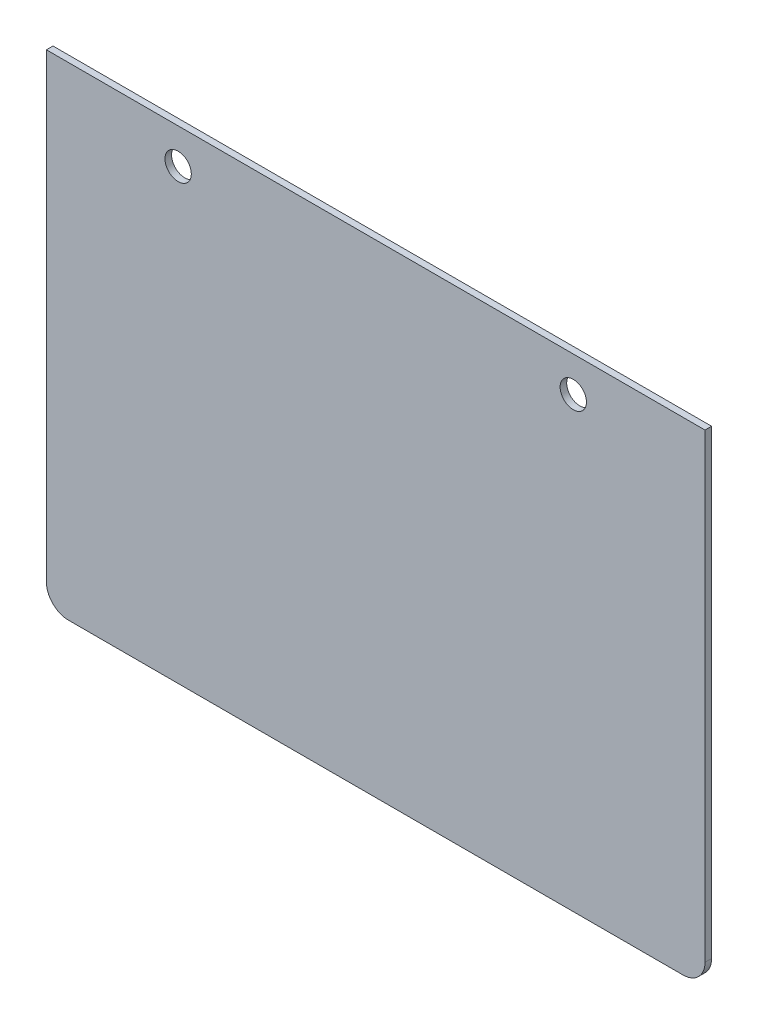
ISO-10303-21;
HEADER;
FILE_DESCRIPTION(('STEP AP214'),'2;1');
FILE_NAME('part.step','',(''),(''),'','','');
FILE_SCHEMA(('AUTOMOTIVE_DESIGN { 1 0 10303 214 1 1 1 1 }'));
ENDSEC;
DATA;
#1=APPLICATION_CONTEXT('core data for automotive mechanical design processes');
#2=APPLICATION_PROTOCOL_DEFINITION('international standard','automotive_design',2000,#1);
#3=PRODUCT_CONTEXT('',#1,'mechanical');
#4=PRODUCT('Part','Part','',(#3));
#5=PRODUCT_RELATED_PRODUCT_CATEGORY('part','',(#4));
#6=PRODUCT_DEFINITION_FORMATION('','',#4);
#7=PRODUCT_DEFINITION_CONTEXT('part definition',#1,'design');
#8=PRODUCT_DEFINITION('design','',#6,#7);
#9=PRODUCT_DEFINITION_SHAPE('','',#8);
#10=(LENGTH_UNIT() NAMED_UNIT(*) SI_UNIT(.MILLI.,.METRE.));
#11=(NAMED_UNIT(*) PLANE_ANGLE_UNIT() SI_UNIT($,.RADIAN.));
#12=(NAMED_UNIT(*) SI_UNIT($,.STERADIAN.) SOLID_ANGLE_UNIT());
#13=UNCERTAINTY_MEASURE_WITH_UNIT(LENGTH_MEASURE(1.E-05),#10,'distance_accuracy_value','');
#14=(GEOMETRIC_REPRESENTATION_CONTEXT(3) GLOBAL_UNCERTAINTY_ASSIGNED_CONTEXT((#13)) GLOBAL_UNIT_ASSIGNED_CONTEXT((#10,
#11,#12)) REPRESENTATION_CONTEXT('',''));
#15=CARTESIAN_POINT('',(0.,0.,0.));
#16=DIRECTION('',(0.,0.,1.));
#17=DIRECTION('',(1.,0.,0.));
#18=AXIS2_PLACEMENT_3D('',#15,#16,#17);
#19=CARTESIAN_POINT('',(0.,0.,-1.5));
#20=DIRECTION('',(-1.,0.,0.));
#21=DIRECTION('',(0.,0.,1.));
#22=AXIS2_PLACEMENT_3D('',#19,#20,#21);
#23=PLANE('',#22);
#24=DIRECTION('',(0.,-1.,0.));
#25=VECTOR('',#24,1.);
#26=CARTESIAN_POINT('',(0.,0.,-1.5));
#27=LINE('',#26,#25);
#28=CARTESIAN_POINT('',(0.,110.,-1.5));
#29=VERTEX_POINT('',#28);
#30=CARTESIAN_POINT('',(0.,5.,-1.5));
#31=VERTEX_POINT('',#30);
#32=EDGE_CURVE('E107',#29,#31,#27,.T.);
#33=ORIENTED_EDGE('',*,*,#32,.T.);
#34=DIRECTION('',(0.,0.,1.));
#35=VECTOR('',#34,1.);
#36=CARTESIAN_POINT('',(0.,5.,-1.5));
#37=LINE('',#36,#35);
#38=CARTESIAN_POINT('',(0.,5.,0.));
#39=VERTEX_POINT('',#38);
#40=EDGE_CURVE('E11',#31,#39,#37,.T.);
#41=ORIENTED_EDGE('',*,*,#40,.T.);
#42=DIRECTION('',(0.,-1.,0.));
#43=VECTOR('',#42,1.);
#44=CARTESIAN_POINT('',(0.,0.,0.));
#45=LINE('',#44,#43);
#46=CARTESIAN_POINT('',(0.,110.,0.));
#47=VERTEX_POINT('',#46);
#48=EDGE_CURVE('E111',#47,#39,#45,.T.);
#49=ORIENTED_EDGE('',*,*,#48,.F.);
#50=DIRECTION('',(0.,0.,1.));
#51=VECTOR('',#50,1.);
#52=CARTESIAN_POINT('',(0.,110.,-1.5));
#53=LINE('',#52,#51);
#54=EDGE_CURVE('E104',#29,#47,#53,.T.);
#55=ORIENTED_EDGE('',*,*,#54,.F.);
#56=EDGE_LOOP('',(#33,#41,#49,#55));
#57=FACE_BOUND('',#56,.T.);
#58=ADVANCED_FACE('F35',(#57),#23,.T.);
#59=CARTESIAN_POINT('',(0.,110.,-1.5));
#60=DIRECTION('',(0.,1.,0.));
#61=DIRECTION('',(0.,0.,1.));
#62=AXIS2_PLACEMENT_3D('',#59,#60,#61);
#63=PLANE('',#62);
#64=DIRECTION('',(-1.,0.,0.));
#65=VECTOR('',#64,1.);
#66=CARTESIAN_POINT('',(0.,110.,0.));
#67=LINE('',#66,#65);
#68=CARTESIAN_POINT('',(150.,110.,0.));
#69=VERTEX_POINT('',#68);
#70=EDGE_CURVE('E103',#69,#47,#67,.T.);
#71=ORIENTED_EDGE('',*,*,#70,.F.);
#72=DIRECTION('',(0.,0.,1.));
#73=VECTOR('',#72,1.);
#74=CARTESIAN_POINT('',(150.,110.,-1.5));
#75=LINE('',#74,#73);
#76=CARTESIAN_POINT('',(150.,110.,-1.5));
#77=VERTEX_POINT('',#76);
#78=EDGE_CURVE('E92',#77,#69,#75,.T.);
#79=ORIENTED_EDGE('',*,*,#78,.F.);
#80=DIRECTION('',(-1.,0.,0.));
#81=VECTOR('',#80,1.);
#82=CARTESIAN_POINT('',(0.,110.,-1.5));
#83=LINE('',#82,#81);
#84=EDGE_CURVE('E96',#77,#29,#83,.T.);
#85=ORIENTED_EDGE('',*,*,#84,.T.);
#86=ORIENTED_EDGE('',*,*,#54,.T.);
#87=EDGE_LOOP('',(#71,#79,#85,#86));
#88=FACE_BOUND('',#87,.T.);
#89=ADVANCED_FACE('F101',(#88),#63,.T.);
#90=CARTESIAN_POINT('',(150.,0.,-1.5));
#91=DIRECTION('',(1.,0.,0.));
#92=DIRECTION('',(0.,0.,-1.));
#93=AXIS2_PLACEMENT_3D('',#90,#91,#92);
#94=PLANE('',#93);
#95=DIRECTION('',(0.,1.,0.));
#96=VECTOR('',#95,1.);
#97=CARTESIAN_POINT('',(150.,0.,0.));
#98=LINE('',#97,#96);
#99=CARTESIAN_POINT('',(150.,5.,0.));
#100=VERTEX_POINT('',#99);
#101=EDGE_CURVE('E118',#100,#69,#98,.T.);
#102=ORIENTED_EDGE('',*,*,#101,.F.);
#103=DIRECTION('',(0.,0.,1.));
#104=VECTOR('',#103,1.);
#105=CARTESIAN_POINT('',(150.,5.,-1.5));
#106=LINE('',#105,#104);
#107=CARTESIAN_POINT('',(150.,5.,-1.5));
#108=VERTEX_POINT('',#107);
#109=EDGE_CURVE('E58',#100,#108,#106,.F.);
#110=ORIENTED_EDGE('',*,*,#109,.T.);
#111=DIRECTION('',(0.,1.,0.));
#112=VECTOR('',#111,1.);
#113=CARTESIAN_POINT('',(150.,0.,-1.5));
#114=LINE('',#113,#112);
#115=EDGE_CURVE('E89',#108,#77,#114,.T.);
#116=ORIENTED_EDGE('',*,*,#115,.T.);
#117=ORIENTED_EDGE('',*,*,#78,.T.);
#118=EDGE_LOOP('',(#102,#110,#116,#117));
#119=FACE_BOUND('',#118,.T.);
#120=ADVANCED_FACE('F91',(#119),#94,.T.);
#121=CARTESIAN_POINT('',(0.,0.,-1.5));
#122=DIRECTION('',(0.,-1.,0.));
#123=DIRECTION('',(0.,0.,-1.));
#124=AXIS2_PLACEMENT_3D('',#121,#122,#123);
#125=PLANE('',#124);
#126=DIRECTION('',(1.,0.,0.));
#127=VECTOR('',#126,1.);
#128=CARTESIAN_POINT('',(0.,0.,-1.5));
#129=LINE('',#128,#127);
#130=CARTESIAN_POINT('',(5.,0.,-1.5));
#131=VERTEX_POINT('',#130);
#132=CARTESIAN_POINT('',(145.,0.,-1.5));
#133=VERTEX_POINT('',#132);
#134=EDGE_CURVE('E97',#131,#133,#129,.T.);
#135=ORIENTED_EDGE('',*,*,#134,.T.);
#136=DIRECTION('',(0.,0.,1.));
#137=VECTOR('',#136,1.);
#138=CARTESIAN_POINT('',(145.,0.,-1.5));
#139=LINE('',#138,#137);
#140=CARTESIAN_POINT('',(145.,0.,0.));
#141=VERTEX_POINT('',#140);
#142=EDGE_CURVE('E124',#133,#141,#139,.T.);
#143=ORIENTED_EDGE('',*,*,#142,.T.);
#144=DIRECTION('',(1.,0.,0.));
#145=VECTOR('',#144,1.);
#146=CARTESIAN_POINT('',(0.,0.,0.));
#147=LINE('',#146,#145);
#148=CARTESIAN_POINT('',(5.,0.,0.));
#149=VERTEX_POINT('',#148);
#150=EDGE_CURVE('E114',#149,#141,#147,.T.);
#151=ORIENTED_EDGE('',*,*,#150,.F.);
#152=DIRECTION('',(0.,0.,1.));
#153=VECTOR('',#152,1.);
#154=CARTESIAN_POINT('',(5.,0.,-1.5));
#155=LINE('',#154,#153);
#156=EDGE_CURVE('E121',#149,#131,#155,.F.);
#157=ORIENTED_EDGE('',*,*,#156,.T.);
#158=EDGE_LOOP('',(#135,#143,#151,#157));
#159=FACE_BOUND('',#158,.T.);
#160=ADVANCED_FACE('F136',(#159),#125,.T.);
#161=CARTESIAN_POINT('',(0.,110.,-1.5));
#162=DIRECTION('',(0.,0.,-1.));
#163=DIRECTION('',(-1.,0.,0.));
#164=AXIS2_PLACEMENT_3D('',#161,#162,#163);
#165=PLANE('',#164);
#166=CARTESIAN_POINT('',(120.,102.,-1.5));
#167=DIRECTION('',(0.,0.,-1.));
#168=DIRECTION('',(-1.,0.,0.));
#169=AXIS2_PLACEMENT_3D('',#166,#167,#168);
#170=CIRCLE('',#169,2.99999999999999);
#171=CARTESIAN_POINT('',(117.,102.,-1.5));
#172=VERTEX_POINT('',#171);
#173=EDGE_CURVE('E153',#172,#172,#170,.T.);
#174=ORIENTED_EDGE('',*,*,#173,.F.);
#175=EDGE_LOOP('',(#174));
#176=FACE_BOUND('',#175,.T.);
#177=CARTESIAN_POINT('',(30.,102.,-1.5));
#178=DIRECTION('',(0.,0.,-1.));
#179=DIRECTION('',(-1.,0.,0.));
#180=AXIS2_PLACEMENT_3D('',#177,#178,#179);
#181=CIRCLE('',#180,2.99999999999999);
#182=CARTESIAN_POINT('',(27.,102.,-1.5));
#183=VERTEX_POINT('',#182);
#184=EDGE_CURVE('E115',#183,#183,#181,.T.);
#185=ORIENTED_EDGE('',*,*,#184,.F.);
#186=EDGE_LOOP('',(#185));
#187=FACE_BOUND('',#186,.T.);
#188=ORIENTED_EDGE('',*,*,#115,.F.);
#189=CARTESIAN_POINT('',(145.,5.,-1.5));
#190=DIRECTION('',(0.,0.,-1.));
#191=DIRECTION('',(-1.,0.,0.));
#192=AXIS2_PLACEMENT_3D('',#189,#190,#191);
#193=CIRCLE('',#192,5.);
#194=EDGE_CURVE('E43',#108,#133,#193,.T.);
#195=ORIENTED_EDGE('',*,*,#194,.T.);
#196=ORIENTED_EDGE('',*,*,#134,.F.);
#197=CARTESIAN_POINT('',(5.,5.,-1.5));
#198=DIRECTION('',(0.,0.,-1.));
#199=DIRECTION('',(-1.,0.,0.));
#200=AXIS2_PLACEMENT_3D('',#197,#198,#199);
#201=CIRCLE('',#200,5.);
#202=EDGE_CURVE('E50',#131,#31,#201,.T.);
#203=ORIENTED_EDGE('',*,*,#202,.T.);
#204=ORIENTED_EDGE('',*,*,#32,.F.);
#205=ORIENTED_EDGE('',*,*,#84,.F.);
#206=EDGE_LOOP('',(#188,#195,#196,#203,#204,#205));
#207=FACE_BOUND('',#206,.T.);
#208=ADVANCED_FACE('F106',(#176,#187,#207),#165,.T.);
#209=CARTESIAN_POINT('',(0.,110.,0.));
#210=DIRECTION('',(0.,0.,-1.));
#211=DIRECTION('',(-1.,0.,0.));
#212=AXIS2_PLACEMENT_3D('',#209,#210,#211);
#213=PLANE('',#212);
#214=CARTESIAN_POINT('',(120.,102.,0.));
#215=DIRECTION('',(0.,0.,1.));
#216=DIRECTION('',(-1.,0.,0.));
#217=AXIS2_PLACEMENT_3D('',#214,#215,#216);
#218=CIRCLE('',#217,2.99999999999999);
#219=CARTESIAN_POINT('',(117.,102.,0.));
#220=VERTEX_POINT('',#219);
#221=EDGE_CURVE('E156',#220,#220,#218,.T.);
#222=ORIENTED_EDGE('',*,*,#221,.F.);
#223=EDGE_LOOP('',(#222));
#224=FACE_BOUND('',#223,.T.);
#225=CARTESIAN_POINT('',(30.,102.,0.));
#226=DIRECTION('',(0.,0.,1.));
#227=DIRECTION('',(1.,0.,0.));
#228=AXIS2_PLACEMENT_3D('',#225,#226,#227);
#229=CIRCLE('',#228,2.99999999999999);
#230=CARTESIAN_POINT('',(33.,102.,0.));
#231=VERTEX_POINT('',#230);
#232=EDGE_CURVE('E150',#231,#231,#229,.T.);
#233=ORIENTED_EDGE('',*,*,#232,.F.);
#234=EDGE_LOOP('',(#233));
#235=FACE_BOUND('',#234,.T.);
#236=ORIENTED_EDGE('',*,*,#150,.T.);
#237=CARTESIAN_POINT('',(145.,5.,0.));
#238=DIRECTION('',(0.,0.,-1.));
#239=DIRECTION('',(-1.,0.,0.));
#240=AXIS2_PLACEMENT_3D('',#237,#238,#239);
#241=CIRCLE('',#240,5.);
#242=EDGE_CURVE('E129',#141,#100,#241,.F.);
#243=ORIENTED_EDGE('',*,*,#242,.T.);
#244=ORIENTED_EDGE('',*,*,#101,.T.);
#245=ORIENTED_EDGE('',*,*,#70,.T.);
#246=ORIENTED_EDGE('',*,*,#48,.T.);
#247=CARTESIAN_POINT('',(5.,5.,0.));
#248=DIRECTION('',(0.,0.,-1.));
#249=DIRECTION('',(-1.,0.,0.));
#250=AXIS2_PLACEMENT_3D('',#247,#248,#249);
#251=CIRCLE('',#250,5.);
#252=EDGE_CURVE('E127',#39,#149,#251,.F.);
#253=ORIENTED_EDGE('',*,*,#252,.T.);
#254=EDGE_LOOP('',(#236,#243,#244,#245,#246,#253));
#255=FACE_BOUND('',#254,.T.);
#256=ADVANCED_FACE('F141',(#224,#235,#255),#213,.F.);
#257=CARTESIAN_POINT('',(30.,102.,-10.));
#258=DIRECTION('',(0.,0.,1.));
#259=DIRECTION('',(1.,0.,0.));
#260=AXIS2_PLACEMENT_3D('',#257,#258,#259);
#261=CYLINDRICAL_SURFACE('',#260,2.99999999999999);
#262=ORIENTED_EDGE('',*,*,#184,.T.);
#263=EDGE_LOOP('',(#262));
#264=FACE_BOUND('',#263,.T.);
#265=ORIENTED_EDGE('',*,*,#232,.T.);
#266=EDGE_LOOP('',(#265));
#267=FACE_BOUND('',#266,.T.);
#268=ADVANCED_FACE('F164',(#264,#267),#261,.F.);
#269=CARTESIAN_POINT('',(120.,102.,-10.));
#270=DIRECTION('',(0.,0.,1.));
#271=DIRECTION('',(1.,0.,0.));
#272=AXIS2_PLACEMENT_3D('',#269,#270,#271);
#273=CYLINDRICAL_SURFACE('',#272,2.99999999999999);
#274=ORIENTED_EDGE('',*,*,#173,.T.);
#275=EDGE_LOOP('',(#274));
#276=FACE_BOUND('',#275,.T.);
#277=ORIENTED_EDGE('',*,*,#221,.T.);
#278=EDGE_LOOP('',(#277));
#279=FACE_BOUND('',#278,.T.);
#280=ADVANCED_FACE('F160',(#276,#279),#273,.F.);
#281=CARTESIAN_POINT('',(145.,5.,-1.5));
#282=DIRECTION('',(0.,0.,1.));
#283=DIRECTION('',(1.,0.,0.));
#284=AXIS2_PLACEMENT_3D('',#281,#282,#283);
#285=CYLINDRICAL_SURFACE('',#284,5.);
#286=ORIENTED_EDGE('',*,*,#194,.F.);
#287=ORIENTED_EDGE('',*,*,#109,.F.);
#288=ORIENTED_EDGE('',*,*,#242,.F.);
#289=ORIENTED_EDGE('',*,*,#142,.F.);
#290=EDGE_LOOP('',(#286,#287,#288,#289));
#291=FACE_BOUND('',#290,.T.);
#292=ADVANCED_FACE('F139',(#291),#285,.T.);
#293=CARTESIAN_POINT('',(5.,5.,-1.5));
#294=DIRECTION('',(0.,0.,1.));
#295=DIRECTION('',(1.,0.,0.));
#296=AXIS2_PLACEMENT_3D('',#293,#294,#295);
#297=CYLINDRICAL_SURFACE('',#296,5.);
#298=ORIENTED_EDGE('',*,*,#202,.F.);
#299=ORIENTED_EDGE('',*,*,#156,.F.);
#300=ORIENTED_EDGE('',*,*,#252,.F.);
#301=ORIENTED_EDGE('',*,*,#40,.F.);
#302=EDGE_LOOP('',(#298,#299,#300,#301));
#303=FACE_BOUND('',#302,.T.);
#304=ADVANCED_FACE('F37',(#303),#297,.T.);
#305=CLOSED_SHELL('',(#58,#89,#120,#160,#208,#256,#268,#280,#292,#304));
#306=MANIFOLD_SOLID_BREP('B2',#305);
#307=ADVANCED_BREP_SHAPE_REPRESENTATION('',(#18,#306),#14);
#308=SHAPE_DEFINITION_REPRESENTATION(#9,#307);
ENDSEC;
END-ISO-10303-21;
